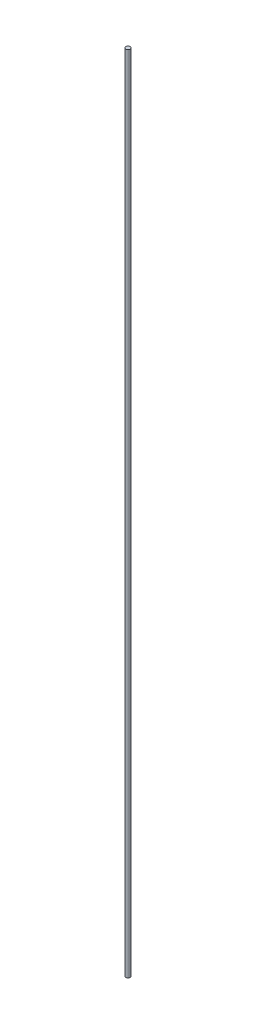
ISO-10303-21;
HEADER;
FILE_DESCRIPTION(('STEP AP214'),'2;1');
FILE_NAME('part.step','',(''),(''),'','','');
FILE_SCHEMA(('AUTOMOTIVE_DESIGN { 1 0 10303 214 1 1 1 1 }'));
ENDSEC;
DATA;
#1=APPLICATION_CONTEXT('core data for automotive mechanical design processes');
#2=APPLICATION_PROTOCOL_DEFINITION('international standard','automotive_design',2000,#1);
#3=PRODUCT_CONTEXT('',#1,'mechanical');
#4=PRODUCT('Part','Part','',(#3));
#5=PRODUCT_RELATED_PRODUCT_CATEGORY('part','',(#4));
#6=PRODUCT_DEFINITION_FORMATION('','',#4);
#7=PRODUCT_DEFINITION_CONTEXT('part definition',#1,'design');
#8=PRODUCT_DEFINITION('design','',#6,#7);
#9=PRODUCT_DEFINITION_SHAPE('','',#8);
#10=(LENGTH_UNIT() NAMED_UNIT(*) SI_UNIT(.MILLI.,.METRE.));
#11=(NAMED_UNIT(*) PLANE_ANGLE_UNIT() SI_UNIT($,.RADIAN.));
#12=(NAMED_UNIT(*) SI_UNIT($,.STERADIAN.) SOLID_ANGLE_UNIT());
#13=UNCERTAINTY_MEASURE_WITH_UNIT(LENGTH_MEASURE(1.E-05),#10,'distance_accuracy_value','');
#14=(GEOMETRIC_REPRESENTATION_CONTEXT(3) GLOBAL_UNCERTAINTY_ASSIGNED_CONTEXT((#13)) GLOBAL_UNIT_ASSIGNED_CONTEXT((#10,
#11,#12)) REPRESENTATION_CONTEXT('',''));
#15=CARTESIAN_POINT('',(0.,0.,0.));
#16=DIRECTION('',(0.,0.,1.));
#17=DIRECTION('',(1.,0.,0.));
#18=AXIS2_PLACEMENT_3D('',#15,#16,#17);
#19=CARTESIAN_POINT('',(0.,36.,0.));
#20=DIRECTION('',(0.,-1.,0.));
#21=DIRECTION('',(0.,0.,-1.));
#22=AXIS2_PLACEMENT_3D('',#19,#20,#21);
#23=CYLINDRICAL_SURFACE('',#22,0.0999999999999998);
#24=CARTESIAN_POINT('',(0.,36.,0.));
#25=DIRECTION('',(0.,1.,0.));
#26=DIRECTION('',(0.,0.,1.));
#27=AXIS2_PLACEMENT_3D('',#24,#25,#26);
#28=CIRCLE('',#27,0.0999999999999998);
#29=CARTESIAN_POINT('',(0.,36.,0.0999999999999998));
#30=VERTEX_POINT('',#29);
#31=EDGE_CURVE('E10',#30,#30,#28,.T.);
#32=ORIENTED_EDGE('',*,*,#31,.F.);
#33=EDGE_LOOP('',(#32));
#34=FACE_BOUND('',#33,.T.);
#35=CARTESIAN_POINT('',(0.,0.,0.));
#36=DIRECTION('',(0.,1.,0.));
#37=DIRECTION('',(0.,0.,1.));
#38=AXIS2_PLACEMENT_3D('',#35,#36,#37);
#39=CIRCLE('',#38,0.0999999999999998);
#40=CARTESIAN_POINT('',(0.,0.,0.0999999999999998));
#41=VERTEX_POINT('',#40);
#42=EDGE_CURVE('E34',#41,#41,#39,.T.);
#43=ORIENTED_EDGE('',*,*,#42,.T.);
#44=EDGE_LOOP('',(#43));
#45=FACE_BOUND('',#44,.T.);
#46=ADVANCED_FACE('F31',(#34,#45),#23,.T.);
#47=CARTESIAN_POINT('',(0.,36.,0.));
#48=DIRECTION('',(0.,1.,0.));
#49=DIRECTION('',(0.,0.,1.));
#50=AXIS2_PLACEMENT_3D('',#47,#48,#49);
#51=PLANE('',#50);
#52=ORIENTED_EDGE('',*,*,#31,.T.);
#53=EDGE_LOOP('',(#52));
#54=FACE_BOUND('',#53,.T.);
#55=ADVANCED_FACE('F46',(#54),#51,.T.);
#56=CARTESIAN_POINT('',(0.,0.,0.));
#57=DIRECTION('',(0.,1.,0.));
#58=DIRECTION('',(0.,0.,1.));
#59=AXIS2_PLACEMENT_3D('',#56,#57,#58);
#60=PLANE('',#59);
#61=ORIENTED_EDGE('',*,*,#42,.F.);
#62=EDGE_LOOP('',(#61));
#63=FACE_BOUND('',#62,.T.);
#64=ADVANCED_FACE('F44',(#63),#60,.F.);
#65=CLOSED_SHELL('',(#46,#55,#64));
#66=MANIFOLD_SOLID_BREP('B2',#65);
#67=ADVANCED_BREP_SHAPE_REPRESENTATION('',(#18,#66),#14);
#68=SHAPE_DEFINITION_REPRESENTATION(#9,#67);
ENDSEC;
END-ISO-10303-21;
